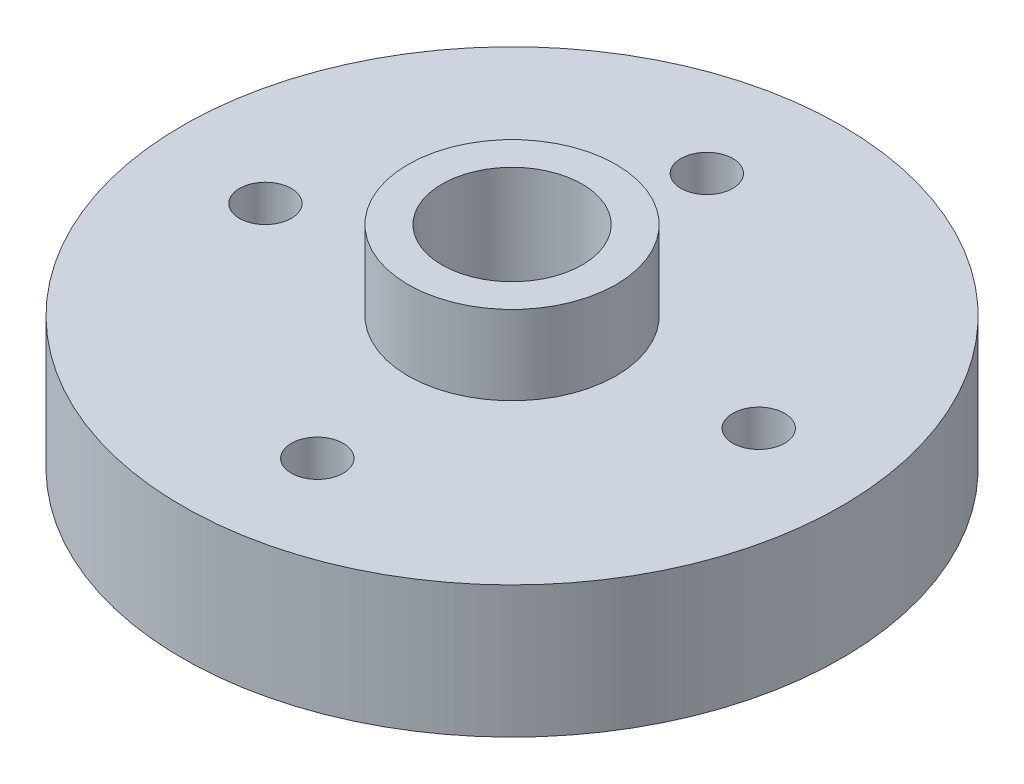
ISO-10303-21;
HEADER;
FILE_DESCRIPTION(('STEP AP214'),'2;1');
FILE_NAME('part.step','',(''),(''),'','','');
FILE_SCHEMA(('AUTOMOTIVE_DESIGN { 1 0 10303 214 1 1 1 1 }'));
ENDSEC;
DATA;
#1=APPLICATION_CONTEXT('core data for automotive mechanical design processes');
#2=APPLICATION_PROTOCOL_DEFINITION('international standard','automotive_design',2000,#1);
#3=PRODUCT_CONTEXT('',#1,'mechanical');
#4=PRODUCT('Part','Part','',(#3));
#5=PRODUCT_RELATED_PRODUCT_CATEGORY('part','',(#4));
#6=PRODUCT_DEFINITION_FORMATION('','',#4);
#7=PRODUCT_DEFINITION_CONTEXT('part definition',#1,'design');
#8=PRODUCT_DEFINITION('design','',#6,#7);
#9=PRODUCT_DEFINITION_SHAPE('','',#8);
#10=(LENGTH_UNIT() NAMED_UNIT(*) SI_UNIT(.MILLI.,.METRE.));
#11=(NAMED_UNIT(*) PLANE_ANGLE_UNIT() SI_UNIT($,.RADIAN.));
#12=(NAMED_UNIT(*) SI_UNIT($,.STERADIAN.) SOLID_ANGLE_UNIT());
#13=UNCERTAINTY_MEASURE_WITH_UNIT(LENGTH_MEASURE(1.E-05),#10,'distance_accuracy_value','');
#14=(GEOMETRIC_REPRESENTATION_CONTEXT(3) GLOBAL_UNCERTAINTY_ASSIGNED_CONTEXT((#13)) GLOBAL_UNIT_ASSIGNED_CONTEXT((#10,
#11,#12)) REPRESENTATION_CONTEXT('',''));
#15=CARTESIAN_POINT('',(0.,0.,0.));
#16=DIRECTION('',(0.,0.,1.));
#17=DIRECTION('',(1.,0.,0.));
#18=AXIS2_PLACEMENT_3D('',#15,#16,#17);
#19=CARTESIAN_POINT('',(0.,3.81,0.));
#20=DIRECTION('',(0.,-1.,0.));
#21=DIRECTION('',(0.,0.,-1.));
#22=AXIS2_PLACEMENT_3D('',#19,#20,#21);
#23=CYLINDRICAL_SURFACE('',#22,9.525);
#24=CARTESIAN_POINT('',(0.,3.81,0.));
#25=DIRECTION('',(0.,1.,0.));
#26=DIRECTION('',(0.,0.,1.));
#27=AXIS2_PLACEMENT_3D('',#24,#25,#26);
#28=CIRCLE('',#27,9.525);
#29=CARTESIAN_POINT('',(0.,3.81,-9.525));
#30=VERTEX_POINT('',#29);
#31=EDGE_CURVE('E38',#30,#30,#28,.T.);
#32=CARTESIAN_POINT('',(0.,0.,0.));
#33=DIRECTION('',(0.,1.,0.));
#34=DIRECTION('',(0.,0.,1.));
#35=AXIS2_PLACEMENT_3D('',#32,#33,#34);
#36=CIRCLE('',#35,9.525);
#37=CARTESIAN_POINT('',(0.,0.,-9.525));
#38=VERTEX_POINT('',#37);
#39=EDGE_CURVE('E43',#38,#38,#36,.T.);
#40=CARTESIAN_POINT('',(0.,3.81,-9.525));
#41=CARTESIAN_POINT('',(0.,3.7703125,-9.525));
#42=CARTESIAN_POINT('',(0.,3.730625,-9.525));
#43=CARTESIAN_POINT('',(0.,3.65125,-9.525));
#44=CARTESIAN_POINT('',(0.,3.6115625,-9.525));
#45=CARTESIAN_POINT('',(0.,3.5321875,-9.525));
#46=CARTESIAN_POINT('',(0.,3.4925,-9.525));
#47=CARTESIAN_POINT('',(0.,3.413125,-9.525));
#48=CARTESIAN_POINT('',(0.,3.3734375,-9.525));
#49=CARTESIAN_POINT('',(0.,3.2940625,-9.525));
#50=CARTESIAN_POINT('',(0.,3.254375,-9.525));
#51=CARTESIAN_POINT('',(0.,3.175,-9.525));
#52=CARTESIAN_POINT('',(0.,3.1353125,-9.525));
#53=CARTESIAN_POINT('',(0.,3.0559375,-9.525));
#54=CARTESIAN_POINT('',(0.,3.01625,-9.525));
#55=CARTESIAN_POINT('',(0.,2.936875,-9.525));
#56=CARTESIAN_POINT('',(0.,2.8971875,-9.525));
#57=CARTESIAN_POINT('',(0.,2.8178125,-9.525));
#58=CARTESIAN_POINT('',(0.,2.778125,-9.525));
#59=CARTESIAN_POINT('',(0.,2.69875,-9.525));
#60=CARTESIAN_POINT('',(0.,2.6590625,-9.525));
#61=CARTESIAN_POINT('',(0.,2.5796875,-9.525));
#62=CARTESIAN_POINT('',(0.,2.54,-9.525));
#63=CARTESIAN_POINT('',(0.,2.460625,-9.525));
#64=CARTESIAN_POINT('',(0.,2.4209375,-9.525));
#65=CARTESIAN_POINT('',(0.,2.3415625,-9.525));
#66=CARTESIAN_POINT('',(0.,2.301875,-9.525));
#67=CARTESIAN_POINT('',(0.,2.2225,-9.525));
#68=CARTESIAN_POINT('',(0.,2.1828125,-9.525));
#69=CARTESIAN_POINT('',(0.,2.1034375,-9.525));
#70=CARTESIAN_POINT('',(0.,2.06375,-9.525));
#71=CARTESIAN_POINT('',(0.,1.984375,-9.525));
#72=CARTESIAN_POINT('',(0.,1.9446875,-9.525));
#73=CARTESIAN_POINT('',(0.,1.8653125,-9.525));
#74=CARTESIAN_POINT('',(0.,1.825625,-9.525));
#75=CARTESIAN_POINT('',(0.,1.74625,-9.525));
#76=CARTESIAN_POINT('',(0.,1.7065625,-9.525));
#77=CARTESIAN_POINT('',(0.,1.6271875,-9.525));
#78=CARTESIAN_POINT('',(0.,1.5875,-9.525));
#79=CARTESIAN_POINT('',(0.,1.508125,-9.525));
#80=CARTESIAN_POINT('',(0.,1.4684375,-9.525));
#81=CARTESIAN_POINT('',(0.,1.3890625,-9.525));
#82=CARTESIAN_POINT('',(0.,1.349375,-9.525));
#83=CARTESIAN_POINT('',(0.,1.27,-9.525));
#84=CARTESIAN_POINT('',(0.,1.2303125,-9.525));
#85=CARTESIAN_POINT('',(0.,1.1509375,-9.525));
#86=CARTESIAN_POINT('',(0.,1.11125,-9.525));
#87=CARTESIAN_POINT('',(0.,1.031875,-9.525));
#88=CARTESIAN_POINT('',(0.,0.9921875,-9.525));
#89=CARTESIAN_POINT('',(0.,0.9128125,-9.525));
#90=CARTESIAN_POINT('',(0.,0.873125,-9.525));
#91=CARTESIAN_POINT('',(0.,0.79375,-9.525));
#92=CARTESIAN_POINT('',(0.,0.7540625,-9.525));
#93=CARTESIAN_POINT('',(0.,0.6746875,-9.525));
#94=CARTESIAN_POINT('',(0.,0.635,-9.525));
#95=CARTESIAN_POINT('',(0.,0.555625,-9.525));
#96=CARTESIAN_POINT('',(0.,0.5159375,-9.525));
#97=CARTESIAN_POINT('',(0.,0.4365625,-9.525));
#98=CARTESIAN_POINT('',(0.,0.396875,-9.525));
#99=CARTESIAN_POINT('',(0.,0.3175,-9.525));
#100=CARTESIAN_POINT('',(0.,0.2778125,-9.525));
#101=CARTESIAN_POINT('',(0.,0.1984375,-9.525));
#102=CARTESIAN_POINT('',(0.,0.15875,-9.525));
#103=CARTESIAN_POINT('',(0.,0.0793749999999999,-9.525));
#104=CARTESIAN_POINT('',(0.,0.0396874999999999,-9.525));
#105=CARTESIAN_POINT('',(0.,0.,-9.525));
#106=B_SPLINE_CURVE_WITH_KNOTS('',3,(#40,#41,#42,#43,#44,#45,#46,#47,#48,#49,#50,#51,#52,#53,
#54,#55,#56,#57,#58,#59,#60,#61,#62,#63,#64,#65,#66,#67,#68,#69,#70,#71,#72,#73,#74,#75,#76,#77,
#78,#79,#80,#81,#82,#83,#84,#85,#86,#87,#88,#89,#90,#91,#92,#93,#94,#95,#96,#97,#98,#99,#100,
#101,#102,#103,#104,#105),.UNSPECIFIED.,.F.,.F.,(4,2,2,2,2,2,2,2,2,2,2,2,2,2,2,2,2,2,2,2,2,2,2,
2,2,2,2,2,2,2,2,2,4),(0.,0.1190625,0.238125,0.3571875,0.47625,0.5953125,0.714375,0.8334375,
0.9525,1.0715625,1.190625,1.3096875,1.42875,1.5478125,1.666875,1.7859375,1.905,2.0240625,
2.143125,2.2621875,2.38125,2.5003125,2.619375,2.7384375,2.8575,2.9765625,3.095625,3.2146875,
3.33375,3.4528125,3.571875,3.6909375,3.81),.UNSPECIFIED.);
#107=EDGE_CURVE('BSEAM31',#30,#38,#106,.T.);
#108=ORIENTED_EDGE('',*,*,#31,.F.);
#109=ORIENTED_EDGE('',*,*,#39,.T.);
#110=ORIENTED_EDGE('',*,*,#107,.T.);
#111=ORIENTED_EDGE('',*,*,#107,.F.);
#112=EDGE_LOOP('',(#108,#110,#109,#111));
#113=FACE_BOUND('',#112,.T.);
#114=ADVANCED_FACE('F31',(#113),#23,.T.);
#115=CARTESIAN_POINT('',(0.,3.81,0.));
#116=DIRECTION('',(0.,1.,0.));
#117=DIRECTION('',(0.,0.,1.));
#118=AXIS2_PLACEMENT_3D('',#115,#116,#117);
#119=PLANE('',#118);
#120=CARTESIAN_POINT('',(-0.749981853388704,3.81,-6.37880308143224));
#121=DIRECTION('',(0.,1.,0.));
#122=DIRECTION('',(0.,0.,1.));
#123=AXIS2_PLACEMENT_3D('',#120,#121,#122);
#124=CIRCLE('',#123,0.749981853388704);
#125=CARTESIAN_POINT('',(-0.749981853388704,3.81,-5.62882122804353));
#126=VERTEX_POINT('',#125);
#127=EDGE_CURVE('E55',#126,#126,#124,.T.);
#128=ORIENTED_EDGE('',*,*,#127,.F.);
#129=EDGE_LOOP('',(#128));
#130=FACE_BOUND('',#129,.T.);
#131=CARTESIAN_POINT('',(6.3788030814324,3.81,-0.749981853388906));
#132=DIRECTION('',(0.,1.,0.));
#133=DIRECTION('',(0.,0.,1.));
#134=AXIS2_PLACEMENT_3D('',#131,#132,#133);
#135=CIRCLE('',#134,0.749981853388872);
#136=CARTESIAN_POINT('',(6.3788030814324,3.81,0.));
#137=VERTEX_POINT('',#136);
#138=EDGE_CURVE('E102',#137,#137,#135,.T.);
#139=ORIENTED_EDGE('',*,*,#138,.F.);
#140=EDGE_LOOP('',(#139));
#141=FACE_BOUND('',#140,.T.);
#142=CARTESIAN_POINT('',(0.749981853389067,3.81,6.3788030814322));
#143=DIRECTION('',(0.,1.,0.));
#144=DIRECTION('',(0.,0.,1.));
#145=AXIS2_PLACEMENT_3D('',#142,#143,#144);
#146=CIRCLE('',#145,0.749981853389107);
#147=CARTESIAN_POINT('',(0.749981853389067,3.81,7.1287849348213));
#148=VERTEX_POINT('',#147);
#149=EDGE_CURVE('E106',#148,#148,#146,.T.);
#150=ORIENTED_EDGE('',*,*,#149,.F.);
#151=EDGE_LOOP('',(#150));
#152=FACE_BOUND('',#151,.T.);
#153=CARTESIAN_POINT('',(-6.37880308143204,3.81,0.749981853388865));
#154=DIRECTION('',(0.,1.,0.));
#155=DIRECTION('',(0.,0.,1.));
#156=AXIS2_PLACEMENT_3D('',#153,#154,#155);
#157=CIRCLE('',#156,0.749981853388983);
#158=CARTESIAN_POINT('',(-6.37880308143204,3.81,1.49996370677785));
#159=VERTEX_POINT('',#158);
#160=EDGE_CURVE('E110',#159,#159,#157,.T.);
#161=ORIENTED_EDGE('',*,*,#160,.F.);
#162=EDGE_LOOP('',(#161));
#163=FACE_BOUND('',#162,.T.);
#164=CARTESIAN_POINT('',(0.,3.81,0.));
#165=DIRECTION('',(0.,1.,0.));
#166=DIRECTION('',(0.,0.,1.));
#167=AXIS2_PLACEMENT_3D('',#164,#165,#166);
#168=CIRCLE('',#167,3.00699532080705);
#169=CARTESIAN_POINT('',(0.,3.81,3.00699532080705));
#170=VERTEX_POINT('',#169);
#171=EDGE_CURVE('E10',#170,#170,#168,.T.);
#172=ORIENTED_EDGE('',*,*,#171,.F.);
#173=EDGE_LOOP('',(#172));
#174=FACE_BOUND('',#173,.T.);
#175=ORIENTED_EDGE('',*,*,#31,.T.);
#176=EDGE_LOOP('',(#175));
#177=FACE_BOUND('',#176,.T.);
#178=ADVANCED_FACE('F80',(#130,#141,#152,#163,#174,#177),#119,.T.);
#179=CARTESIAN_POINT('',(0.,0.,0.));
#180=DIRECTION('',(0.,1.,0.));
#181=DIRECTION('',(0.,0.,1.));
#182=AXIS2_PLACEMENT_3D('',#179,#180,#181);
#183=PLANE('',#182);
#184=CARTESIAN_POINT('',(0.,0.,0.));
#185=DIRECTION('',(0.,1.,0.));
#186=DIRECTION('',(0.,0.,1.));
#187=AXIS2_PLACEMENT_3D('',#184,#185,#186);
#188=CIRCLE('',#187,2.02646881033543);
#189=CARTESIAN_POINT('',(0.,0.,2.02646881033543));
#190=VERTEX_POINT('',#189);
#191=EDGE_CURVE('E112',#190,#190,#188,.T.);
#192=ORIENTED_EDGE('',*,*,#191,.T.);
#193=EDGE_LOOP('',(#192));
#194=FACE_BOUND('',#193,.T.);
#195=CARTESIAN_POINT('',(-0.749981853388704,0.,-6.37880308143224));
#196=DIRECTION('',(0.,1.,0.));
#197=DIRECTION('',(0.,0.,1.));
#198=AXIS2_PLACEMENT_3D('',#195,#196,#197);
#199=CIRCLE('',#198,0.749981853388704);
#200=CARTESIAN_POINT('',(-0.749981853388704,0.,-5.62882122804353));
#201=VERTEX_POINT('',#200);
#202=EDGE_CURVE('E34',#201,#201,#199,.T.);
#203=ORIENTED_EDGE('',*,*,#202,.T.);
#204=EDGE_LOOP('',(#203));
#205=FACE_BOUND('',#204,.T.);
#206=CARTESIAN_POINT('',(6.3788030814324,0.,-0.749981853388906));
#207=DIRECTION('',(0.,1.,0.));
#208=DIRECTION('',(0.,0.,1.));
#209=AXIS2_PLACEMENT_3D('',#206,#207,#208);
#210=CIRCLE('',#209,0.749981853388872);
#211=CARTESIAN_POINT('',(6.3788030814324,0.,0.));
#212=VERTEX_POINT('',#211);
#213=EDGE_CURVE('E57',#212,#212,#210,.T.);
#214=ORIENTED_EDGE('',*,*,#213,.T.);
#215=EDGE_LOOP('',(#214));
#216=FACE_BOUND('',#215,.T.);
#217=CARTESIAN_POINT('',(0.749981853389067,0.,6.3788030814322));
#218=DIRECTION('',(0.,1.,0.));
#219=DIRECTION('',(0.,0.,1.));
#220=AXIS2_PLACEMENT_3D('',#217,#218,#219);
#221=CIRCLE('',#220,0.749981853389107);
#222=CARTESIAN_POINT('',(0.749981853389067,0.,7.1287849348213));
#223=VERTEX_POINT('',#222);
#224=EDGE_CURVE('E54',#223,#223,#221,.T.);
#225=ORIENTED_EDGE('',*,*,#224,.T.);
#226=EDGE_LOOP('',(#225));
#227=FACE_BOUND('',#226,.T.);
#228=CARTESIAN_POINT('',(-6.37880308143204,0.,0.749981853388865));
#229=DIRECTION('',(0.,1.,0.));
#230=DIRECTION('',(0.,0.,1.));
#231=AXIS2_PLACEMENT_3D('',#228,#229,#230);
#232=CIRCLE('',#231,0.749981853388983);
#233=CARTESIAN_POINT('',(-6.37880308143204,0.,1.49996370677785));
#234=VERTEX_POINT('',#233);
#235=EDGE_CURVE('E51',#234,#234,#232,.T.);
#236=ORIENTED_EDGE('',*,*,#235,.T.);
#237=EDGE_LOOP('',(#236));
#238=FACE_BOUND('',#237,.T.);
#239=ORIENTED_EDGE('',*,*,#39,.F.);
#240=EDGE_LOOP('',(#239));
#241=FACE_BOUND('',#240,.T.);
#242=ADVANCED_FACE('F71',(#194,#205,#216,#227,#238,#241),#183,.F.);
#243=CARTESIAN_POINT('',(0.,6.096,0.));
#244=DIRECTION('',(0.,-1.,0.));
#245=DIRECTION('',(0.,0.,-1.));
#246=AXIS2_PLACEMENT_3D('',#243,#244,#245);
#247=CYLINDRICAL_SURFACE('',#246,3.00699532080705);
#248=CARTESIAN_POINT('',(0.,6.096,0.));
#249=DIRECTION('',(0.,1.,0.));
#250=DIRECTION('',(0.,0.,1.));
#251=AXIS2_PLACEMENT_3D('',#248,#249,#250);
#252=CIRCLE('',#251,3.00699532080705);
#253=CARTESIAN_POINT('',(0.,6.096,3.00699532080705));
#254=VERTEX_POINT('',#253);
#255=EDGE_CURVE('E46',#254,#254,#252,.T.);
#256=ORIENTED_EDGE('',*,*,#255,.F.);
#257=EDGE_LOOP('',(#256));
#258=FACE_BOUND('',#257,.T.);
#259=ORIENTED_EDGE('',*,*,#171,.T.);
#260=EDGE_LOOP('',(#259));
#261=FACE_BOUND('',#260,.T.);
#262=ADVANCED_FACE('F69',(#258,#261),#247,.T.);
#263=CARTESIAN_POINT('',(0.,6.096,0.));
#264=DIRECTION('',(0.,1.,0.));
#265=DIRECTION('',(0.,0.,1.));
#266=AXIS2_PLACEMENT_3D('',#263,#264,#265);
#267=PLANE('',#266);
#268=CARTESIAN_POINT('',(0.,6.096,0.));
#269=DIRECTION('',(0.,1.,0.));
#270=DIRECTION('',(0.,0.,1.));
#271=AXIS2_PLACEMENT_3D('',#268,#269,#270);
#272=CIRCLE('',#271,2.02646881033543);
#273=CARTESIAN_POINT('',(0.,6.096,2.02646881033543));
#274=VERTEX_POINT('',#273);
#275=EDGE_CURVE('E115',#274,#274,#272,.T.);
#276=ORIENTED_EDGE('',*,*,#275,.F.);
#277=EDGE_LOOP('',(#276));
#278=FACE_BOUND('',#277,.T.);
#279=ORIENTED_EDGE('',*,*,#255,.T.);
#280=EDGE_LOOP('',(#279));
#281=FACE_BOUND('',#280,.T.);
#282=ADVANCED_FACE('F67',(#278,#281),#267,.T.);
#283=CARTESIAN_POINT('',(-6.37880308143204,-8.636,0.749981853388865));
#284=DIRECTION('',(0.,1.,0.));
#285=DIRECTION('',(0.,0.,1.));
#286=AXIS2_PLACEMENT_3D('',#283,#284,#285);
#287=CYLINDRICAL_SURFACE('',#286,0.749981853388983);
#288=ORIENTED_EDGE('',*,*,#160,.T.);
#289=EDGE_LOOP('',(#288));
#290=FACE_BOUND('',#289,.T.);
#291=ORIENTED_EDGE('',*,*,#235,.F.);
#292=EDGE_LOOP('',(#291));
#293=FACE_BOUND('',#292,.T.);
#294=ADVANCED_FACE('F77',(#290,#293),#287,.F.);
#295=CARTESIAN_POINT('',(0.749981853389067,-8.636,6.3788030814322));
#296=DIRECTION('',(0.,1.,0.));
#297=DIRECTION('',(0.,0.,1.));
#298=AXIS2_PLACEMENT_3D('',#295,#296,#297);
#299=CYLINDRICAL_SURFACE('',#298,0.749981853389107);
#300=ORIENTED_EDGE('',*,*,#149,.T.);
#301=EDGE_LOOP('',(#300));
#302=FACE_BOUND('',#301,.T.);
#303=ORIENTED_EDGE('',*,*,#224,.F.);
#304=EDGE_LOOP('',(#303));
#305=FACE_BOUND('',#304,.T.);
#306=ADVANCED_FACE('F135',(#302,#305),#299,.F.);
#307=CARTESIAN_POINT('',(6.3788030814324,-8.636,-0.749981853388906));
#308=DIRECTION('',(0.,1.,0.));
#309=DIRECTION('',(0.,0.,1.));
#310=AXIS2_PLACEMENT_3D('',#307,#308,#309);
#311=CYLINDRICAL_SURFACE('',#310,0.749981853388872);
#312=ORIENTED_EDGE('',*,*,#138,.T.);
#313=EDGE_LOOP('',(#312));
#314=FACE_BOUND('',#313,.T.);
#315=ORIENTED_EDGE('',*,*,#213,.F.);
#316=EDGE_LOOP('',(#315));
#317=FACE_BOUND('',#316,.T.);
#318=ADVANCED_FACE('F140',(#314,#317),#311,.F.);
#319=CARTESIAN_POINT('',(-0.749981853388704,-8.636,-6.37880308143224));
#320=DIRECTION('',(0.,1.,0.));
#321=DIRECTION('',(0.,0.,1.));
#322=AXIS2_PLACEMENT_3D('',#319,#320,#321);
#323=CYLINDRICAL_SURFACE('',#322,0.749981853388704);
#324=ORIENTED_EDGE('',*,*,#127,.T.);
#325=EDGE_LOOP('',(#324));
#326=FACE_BOUND('',#325,.T.);
#327=ORIENTED_EDGE('',*,*,#202,.F.);
#328=EDGE_LOOP('',(#327));
#329=FACE_BOUND('',#328,.T.);
#330=ADVANCED_FACE('F126',(#326,#329),#323,.F.);
#331=CARTESIAN_POINT('',(0.,-6.35,0.));
#332=DIRECTION('',(0.,1.,0.));
#333=DIRECTION('',(0.,0.,1.));
#334=AXIS2_PLACEMENT_3D('',#331,#332,#333);
#335=CYLINDRICAL_SURFACE('',#334,2.02646881033543);
#336=ORIENTED_EDGE('',*,*,#275,.T.);
#337=EDGE_LOOP('',(#336));
#338=FACE_BOUND('',#337,.T.);
#339=ORIENTED_EDGE('',*,*,#191,.F.);
#340=EDGE_LOOP('',(#339));
#341=FACE_BOUND('',#340,.T.);
#342=ADVANCED_FACE('F123',(#338,#341),#335,.F.);
#343=CLOSED_SHELL('',(#114,#178,#242,#262,#282,#294,#306,#318,#330,#342));
#344=MANIFOLD_SOLID_BREP('B2',#343);
#345=ADVANCED_BREP_SHAPE_REPRESENTATION('',(#18,#344),#14);
#346=SHAPE_DEFINITION_REPRESENTATION(#9,#345);
ENDSEC;
END-ISO-10303-21;
